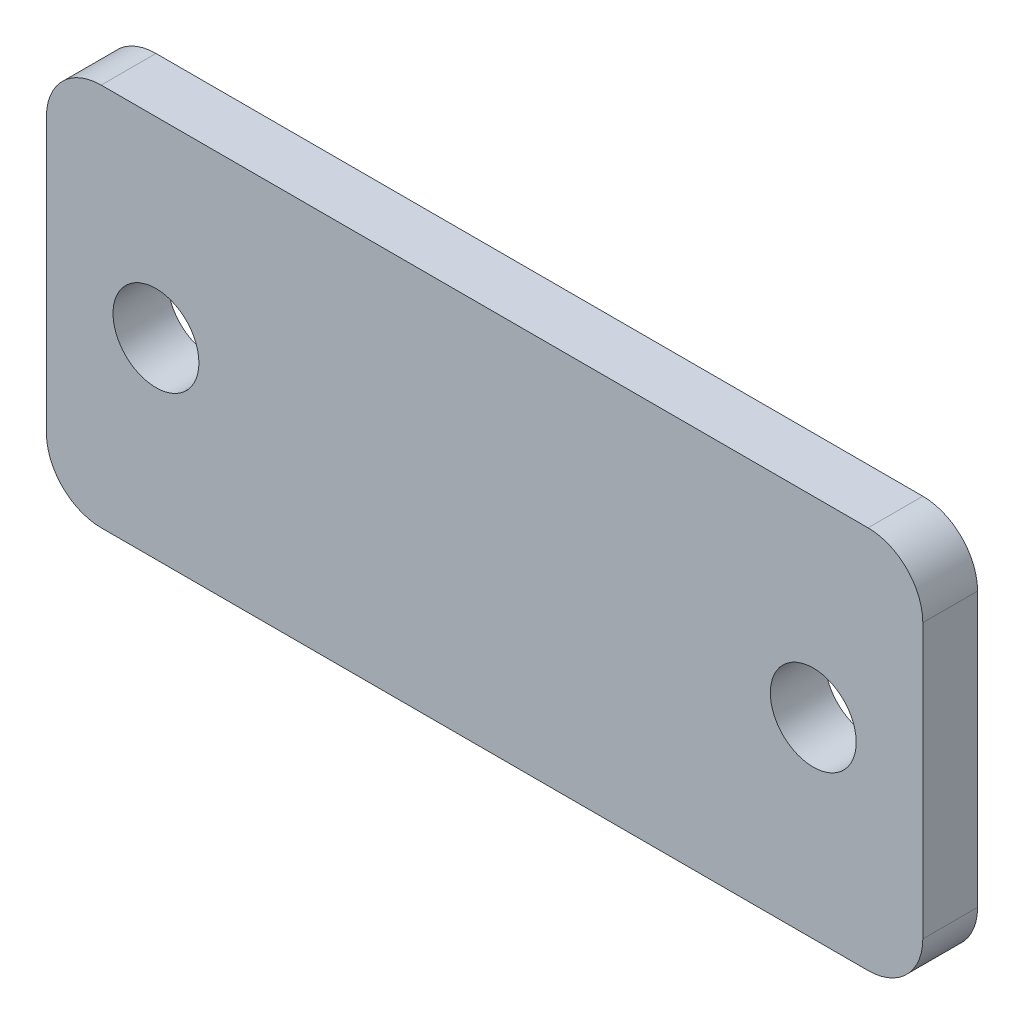
ISO-10303-21;
HEADER;
FILE_DESCRIPTION(('STEP AP214'),'2;1');
FILE_NAME('part.step','',(''),(''),'','','');
FILE_SCHEMA(('AUTOMOTIVE_DESIGN { 1 0 10303 214 1 1 1 1 }'));
ENDSEC;
DATA;
#1=APPLICATION_CONTEXT('core data for automotive mechanical design processes');
#2=APPLICATION_PROTOCOL_DEFINITION('international standard','automotive_design',2000,#1);
#3=PRODUCT_CONTEXT('',#1,'mechanical');
#4=PRODUCT('Part','Part','',(#3));
#5=PRODUCT_RELATED_PRODUCT_CATEGORY('part','',(#4));
#6=PRODUCT_DEFINITION_FORMATION('','',#4);
#7=PRODUCT_DEFINITION_CONTEXT('part definition',#1,'design');
#8=PRODUCT_DEFINITION('design','',#6,#7);
#9=PRODUCT_DEFINITION_SHAPE('','',#8);
#10=(LENGTH_UNIT() NAMED_UNIT(*) SI_UNIT(.MILLI.,.METRE.));
#11=(NAMED_UNIT(*) PLANE_ANGLE_UNIT() SI_UNIT($,.RADIAN.));
#12=(NAMED_UNIT(*) SI_UNIT($,.STERADIAN.) SOLID_ANGLE_UNIT());
#13=UNCERTAINTY_MEASURE_WITH_UNIT(LENGTH_MEASURE(1.E-05),#10,'distance_accuracy_value','');
#14=(GEOMETRIC_REPRESENTATION_CONTEXT(3) GLOBAL_UNCERTAINTY_ASSIGNED_CONTEXT((#13)) GLOBAL_UNIT_ASSIGNED_CONTEXT((#10,
#11,#12)) REPRESENTATION_CONTEXT('',''));
#15=CARTESIAN_POINT('',(0.,0.,0.));
#16=DIRECTION('',(0.,0.,1.));
#17=DIRECTION('',(1.,0.,0.));
#18=AXIS2_PLACEMENT_3D('',#15,#16,#17);
#19=CARTESIAN_POINT('',(0.,0.,3.175));
#20=DIRECTION('',(0.,0.,-1.));
#21=DIRECTION('',(-1.,0.,0.));
#22=AXIS2_PLACEMENT_3D('',#19,#20,#21);
#23=PLANE('',#22);
#24=DIRECTION('',(-1.,0.,0.));
#25=VECTOR('',#24,1.);
#26=CARTESIAN_POINT('',(-25.4,11.1125,3.175));
#27=LINE('',#26,#25);
#28=CARTESIAN_POINT('',(22.225,11.1125,3.175));
#29=VERTEX_POINT('',#28);
#30=CARTESIAN_POINT('',(-22.225,11.1125,3.175));
#31=VERTEX_POINT('',#30);
#32=EDGE_CURVE('E155',#29,#31,#27,.T.);
#33=ORIENTED_EDGE('',*,*,#32,.T.);
#34=CARTESIAN_POINT('',(-22.225,7.9375,3.175));
#35=DIRECTION('',(0.,0.,-1.));
#36=DIRECTION('',(-1.,0.,0.));
#37=AXIS2_PLACEMENT_3D('',#34,#35,#36);
#38=CIRCLE('',#37,3.175);
#39=CARTESIAN_POINT('',(-25.4,7.9375,3.175));
#40=VERTEX_POINT('',#39);
#41=EDGE_CURVE('E184',#31,#40,#38,.F.);
#42=ORIENTED_EDGE('',*,*,#41,.T.);
#43=DIRECTION('',(0.,-1.,0.));
#44=VECTOR('',#43,1.);
#45=CARTESIAN_POINT('',(-25.4,-11.1125,3.175));
#46=LINE('',#45,#44);
#47=CARTESIAN_POINT('',(-25.4,-7.9375,3.175));
#48=VERTEX_POINT('',#47);
#49=EDGE_CURVE('E133',#40,#48,#46,.T.);
#50=ORIENTED_EDGE('',*,*,#49,.T.);
#51=CARTESIAN_POINT('',(-22.225,-7.9375,3.175));
#52=DIRECTION('',(0.,0.,-1.));
#53=DIRECTION('',(-1.,0.,0.));
#54=AXIS2_PLACEMENT_3D('',#51,#52,#53);
#55=CIRCLE('',#54,3.175);
#56=CARTESIAN_POINT('',(-22.225,-11.1125,3.175));
#57=VERTEX_POINT('',#56);
#58=EDGE_CURVE('E179',#48,#57,#55,.F.);
#59=ORIENTED_EDGE('',*,*,#58,.T.);
#60=DIRECTION('',(1.,0.,0.));
#61=VECTOR('',#60,1.);
#62=CARTESIAN_POINT('',(-25.4,-11.1125,3.175));
#63=LINE('',#62,#61);
#64=CARTESIAN_POINT('',(22.225,-11.1125,3.175));
#65=VERTEX_POINT('',#64);
#66=EDGE_CURVE('E199',#57,#65,#63,.T.);
#67=ORIENTED_EDGE('',*,*,#66,.T.);
#68=CARTESIAN_POINT('',(22.225,-7.9375,3.175));
#69=DIRECTION('',(0.,0.,-1.));
#70=DIRECTION('',(-1.,0.,0.));
#71=AXIS2_PLACEMENT_3D('',#68,#69,#70);
#72=CIRCLE('',#71,3.175);
#73=CARTESIAN_POINT('',(25.4,-7.9375,3.175));
#74=VERTEX_POINT('',#73);
#75=EDGE_CURVE('E68',#65,#74,#72,.F.);
#76=ORIENTED_EDGE('',*,*,#75,.T.);
#77=DIRECTION('',(0.,1.,0.));
#78=VECTOR('',#77,1.);
#79=CARTESIAN_POINT('',(25.4,-11.1125,3.175));
#80=LINE('',#79,#78);
#81=CARTESIAN_POINT('',(25.4,7.9375,3.175));
#82=VERTEX_POINT('',#81);
#83=EDGE_CURVE('E207',#74,#82,#80,.T.);
#84=ORIENTED_EDGE('',*,*,#83,.T.);
#85=CARTESIAN_POINT('',(22.225,7.9375,3.175));
#86=DIRECTION('',(0.,0.,-1.));
#87=DIRECTION('',(-1.,0.,0.));
#88=AXIS2_PLACEMENT_3D('',#85,#86,#87);
#89=CIRCLE('',#88,3.175);
#90=EDGE_CURVE('E176',#82,#29,#89,.F.);
#91=ORIENTED_EDGE('',*,*,#90,.T.);
#92=EDGE_LOOP('',(#33,#42,#50,#59,#67,#76,#84,#91));
#93=FACE_BOUND('',#92,.T.);
#94=CARTESIAN_POINT('',(-19.05,0.,3.175));
#95=DIRECTION('',(0.,0.,1.));
#96=DIRECTION('',(1.,0.,0.));
#97=AXIS2_PLACEMENT_3D('',#94,#95,#96);
#98=CIRCLE('',#97,2.4892);
#99=CARTESIAN_POINT('',(-16.5608,0.,3.175));
#100=VERTEX_POINT('',#99);
#101=EDGE_CURVE('E144',#100,#100,#98,.T.);
#102=ORIENTED_EDGE('',*,*,#101,.F.);
#103=EDGE_LOOP('',(#102));
#104=FACE_BOUND('',#103,.T.);
#105=CARTESIAN_POINT('',(19.05,0.,3.175));
#106=DIRECTION('',(0.,0.,1.));
#107=DIRECTION('',(1.,0.,0.));
#108=AXIS2_PLACEMENT_3D('',#105,#106,#107);
#109=CIRCLE('',#108,2.4892);
#110=CARTESIAN_POINT('',(21.5392,0.,3.175));
#111=VERTEX_POINT('',#110);
#112=EDGE_CURVE('E219',#111,#111,#109,.T.);
#113=ORIENTED_EDGE('',*,*,#112,.F.);
#114=EDGE_LOOP('',(#113));
#115=FACE_BOUND('',#114,.T.);
#116=ADVANCED_FACE('F45',(#93,#104,#115),#23,.F.);
#117=CARTESIAN_POINT('',(0.,0.,0.));
#118=DIRECTION('',(0.,0.,-1.));
#119=DIRECTION('',(-1.,0.,0.));
#120=AXIS2_PLACEMENT_3D('',#117,#118,#119);
#121=PLANE('',#120);
#122=CARTESIAN_POINT('',(-19.05,0.,0.));
#123=DIRECTION('',(0.,0.,1.));
#124=DIRECTION('',(1.,0.,0.));
#125=AXIS2_PLACEMENT_3D('',#122,#123,#124);
#126=CIRCLE('',#125,2.4892);
#127=CARTESIAN_POINT('',(-16.5608,0.,0.));
#128=VERTEX_POINT('',#127);
#129=EDGE_CURVE('E152',#128,#128,#126,.T.);
#130=ORIENTED_EDGE('',*,*,#129,.T.);
#131=EDGE_LOOP('',(#130));
#132=FACE_BOUND('',#131,.T.);
#133=DIRECTION('',(0.,-1.,0.));
#134=VECTOR('',#133,1.);
#135=CARTESIAN_POINT('',(-25.4,-11.1125,0.));
#136=LINE('',#135,#134);
#137=CARTESIAN_POINT('',(-25.4,7.9375,0.));
#138=VERTEX_POINT('',#137);
#139=CARTESIAN_POINT('',(-25.4,-7.9375,0.));
#140=VERTEX_POINT('',#139);
#141=EDGE_CURVE('E130',#138,#140,#136,.T.);
#142=ORIENTED_EDGE('',*,*,#141,.F.);
#143=CARTESIAN_POINT('',(-22.225,7.9375,0.));
#144=DIRECTION('',(0.,0.,-1.));
#145=DIRECTION('',(-1.,0.,0.));
#146=AXIS2_PLACEMENT_3D('',#143,#144,#145);
#147=CIRCLE('',#146,3.175);
#148=CARTESIAN_POINT('',(-22.225,11.1125,0.));
#149=VERTEX_POINT('',#148);
#150=EDGE_CURVE('E112',#138,#149,#147,.T.);
#151=ORIENTED_EDGE('',*,*,#150,.T.);
#152=DIRECTION('',(-1.,0.,0.));
#153=VECTOR('',#152,1.);
#154=CARTESIAN_POINT('',(-25.4,11.1125,0.));
#155=LINE('',#154,#153);
#156=CARTESIAN_POINT('',(22.225,11.1125,0.));
#157=VERTEX_POINT('',#156);
#158=EDGE_CURVE('E160',#157,#149,#155,.T.);
#159=ORIENTED_EDGE('',*,*,#158,.F.);
#160=CARTESIAN_POINT('',(22.225,7.9375,0.));
#161=DIRECTION('',(0.,0.,-1.));
#162=DIRECTION('',(-1.,0.,0.));
#163=AXIS2_PLACEMENT_3D('',#160,#161,#162);
#164=CIRCLE('',#163,3.175);
#165=CARTESIAN_POINT('',(25.4,7.9375,0.));
#166=VERTEX_POINT('',#165);
#167=EDGE_CURVE('E135',#157,#166,#164,.T.);
#168=ORIENTED_EDGE('',*,*,#167,.T.);
#169=DIRECTION('',(0.,1.,0.));
#170=VECTOR('',#169,1.);
#171=CARTESIAN_POINT('',(25.4,-11.1125,0.));
#172=LINE('',#171,#170);
#173=CARTESIAN_POINT('',(25.4,-7.9375,0.));
#174=VERTEX_POINT('',#173);
#175=EDGE_CURVE('E149',#174,#166,#172,.T.);
#176=ORIENTED_EDGE('',*,*,#175,.F.);
#177=CARTESIAN_POINT('',(22.225,-7.9375,0.));
#178=DIRECTION('',(0.,0.,-1.));
#179=DIRECTION('',(-1.,0.,0.));
#180=AXIS2_PLACEMENT_3D('',#177,#178,#179);
#181=CIRCLE('',#180,3.175);
#182=CARTESIAN_POINT('',(22.225,-11.1125,0.));
#183=VERTEX_POINT('',#182);
#184=EDGE_CURVE('E124',#174,#183,#181,.T.);
#185=ORIENTED_EDGE('',*,*,#184,.T.);
#186=DIRECTION('',(1.,0.,0.));
#187=VECTOR('',#186,1.);
#188=CARTESIAN_POINT('',(-25.4,-11.1125,0.));
#189=LINE('',#188,#187);
#190=CARTESIAN_POINT('',(-22.225,-11.1125,0.));
#191=VERTEX_POINT('',#190);
#192=EDGE_CURVE('E143',#191,#183,#189,.T.);
#193=ORIENTED_EDGE('',*,*,#192,.F.);
#194=CARTESIAN_POINT('',(-22.225,-7.9375,0.));
#195=DIRECTION('',(0.,0.,-1.));
#196=DIRECTION('',(-1.,0.,0.));
#197=AXIS2_PLACEMENT_3D('',#194,#195,#196);
#198=CIRCLE('',#197,3.175);
#199=EDGE_CURVE('E141',#191,#140,#198,.T.);
#200=ORIENTED_EDGE('',*,*,#199,.T.);
#201=EDGE_LOOP('',(#142,#151,#159,#168,#176,#185,#193,#200));
#202=FACE_BOUND('',#201,.T.);
#203=CARTESIAN_POINT('',(19.05,0.,0.));
#204=DIRECTION('',(0.,0.,1.));
#205=DIRECTION('',(1.,0.,0.));
#206=AXIS2_PLACEMENT_3D('',#203,#204,#205);
#207=CIRCLE('',#206,2.4892);
#208=CARTESIAN_POINT('',(21.5392,0.,0.));
#209=VERTEX_POINT('',#208);
#210=EDGE_CURVE('E221',#209,#209,#207,.T.);
#211=ORIENTED_EDGE('',*,*,#210,.T.);
#212=EDGE_LOOP('',(#211));
#213=FACE_BOUND('',#212,.T.);
#214=ADVANCED_FACE('F138',(#132,#202,#213),#121,.T.);
#215=CARTESIAN_POINT('',(-25.4,-11.1125,3.175));
#216=DIRECTION('',(1.,0.,0.));
#217=DIRECTION('',(0.,0.,-1.));
#218=AXIS2_PLACEMENT_3D('',#215,#216,#217);
#219=PLANE('',#218);
#220=ORIENTED_EDGE('',*,*,#49,.F.);
#221=DIRECTION('',(0.,0.,-1.));
#222=VECTOR('',#221,1.);
#223=CARTESIAN_POINT('',(-25.4,7.9375,3.175));
#224=LINE('',#223,#222);
#225=EDGE_CURVE('E116',#40,#138,#224,.T.);
#226=ORIENTED_EDGE('',*,*,#225,.T.);
#227=ORIENTED_EDGE('',*,*,#141,.T.);
#228=DIRECTION('',(0.,0.,-1.));
#229=VECTOR('',#228,1.);
#230=CARTESIAN_POINT('',(-25.4,-7.9375,3.175));
#231=LINE('',#230,#229);
#232=EDGE_CURVE('E136',#140,#48,#231,.F.);
#233=ORIENTED_EDGE('',*,*,#232,.T.);
#234=EDGE_LOOP('',(#220,#226,#227,#233));
#235=FACE_BOUND('',#234,.T.);
#236=ADVANCED_FACE('F129',(#235),#219,.F.);
#237=CARTESIAN_POINT('',(-25.4,-11.1125,3.175));
#238=DIRECTION('',(0.,1.,0.));
#239=DIRECTION('',(0.,0.,1.));
#240=AXIS2_PLACEMENT_3D('',#237,#238,#239);
#241=PLANE('',#240);
#242=ORIENTED_EDGE('',*,*,#192,.T.);
#243=DIRECTION('',(0.,0.,-1.));
#244=VECTOR('',#243,1.);
#245=CARTESIAN_POINT('',(22.225,-11.1125,3.175));
#246=LINE('',#245,#244);
#247=EDGE_CURVE('E11',#183,#65,#246,.F.);
#248=ORIENTED_EDGE('',*,*,#247,.T.);
#249=ORIENTED_EDGE('',*,*,#66,.F.);
#250=DIRECTION('',(0.,0.,-1.));
#251=VECTOR('',#250,1.);
#252=CARTESIAN_POINT('',(-22.225,-11.1125,3.175));
#253=LINE('',#252,#251);
#254=EDGE_CURVE('E54',#57,#191,#253,.T.);
#255=ORIENTED_EDGE('',*,*,#254,.T.);
#256=EDGE_LOOP('',(#242,#248,#249,#255));
#257=FACE_BOUND('',#256,.T.);
#258=ADVANCED_FACE('F197',(#257),#241,.F.);
#259=CARTESIAN_POINT('',(25.4,-11.1125,3.175));
#260=DIRECTION('',(-1.,0.,0.));
#261=DIRECTION('',(0.,0.,1.));
#262=AXIS2_PLACEMENT_3D('',#259,#260,#261);
#263=PLANE('',#262);
#264=ORIENTED_EDGE('',*,*,#83,.F.);
#265=DIRECTION('',(0.,0.,-1.));
#266=VECTOR('',#265,1.);
#267=CARTESIAN_POINT('',(25.4,-7.9375,3.175));
#268=LINE('',#267,#266);
#269=EDGE_CURVE('E189',#74,#174,#268,.T.);
#270=ORIENTED_EDGE('',*,*,#269,.T.);
#271=ORIENTED_EDGE('',*,*,#175,.T.);
#272=DIRECTION('',(0.,0.,-1.));
#273=VECTOR('',#272,1.);
#274=CARTESIAN_POINT('',(25.4,7.9375,3.175));
#275=LINE('',#274,#273);
#276=EDGE_CURVE('E61',#166,#82,#275,.F.);
#277=ORIENTED_EDGE('',*,*,#276,.T.);
#278=EDGE_LOOP('',(#264,#270,#271,#277));
#279=FACE_BOUND('',#278,.T.);
#280=ADVANCED_FACE('F206',(#279),#263,.F.);
#281=CARTESIAN_POINT('',(-25.4,11.1125,3.175));
#282=DIRECTION('',(0.,-1.,0.));
#283=DIRECTION('',(1.,0.,0.));
#284=AXIS2_PLACEMENT_3D('',#281,#282,#283);
#285=PLANE('',#284);
#286=ORIENTED_EDGE('',*,*,#158,.T.);
#287=DIRECTION('',(0.,0.,-1.));
#288=VECTOR('',#287,1.);
#289=CARTESIAN_POINT('',(-22.225,11.1125,3.175));
#290=LINE('',#289,#288);
#291=EDGE_CURVE('E117',#149,#31,#290,.F.);
#292=ORIENTED_EDGE('',*,*,#291,.T.);
#293=ORIENTED_EDGE('',*,*,#32,.F.);
#294=DIRECTION('',(0.,0.,-1.));
#295=VECTOR('',#294,1.);
#296=CARTESIAN_POINT('',(22.225,11.1125,3.175));
#297=LINE('',#296,#295);
#298=EDGE_CURVE('E123',#29,#157,#297,.T.);
#299=ORIENTED_EDGE('',*,*,#298,.T.);
#300=EDGE_LOOP('',(#286,#292,#293,#299));
#301=FACE_BOUND('',#300,.T.);
#302=ADVANCED_FACE('F245',(#301),#285,.F.);
#303=CARTESIAN_POINT('',(-19.05,0.,3.175));
#304=DIRECTION('',(0.,0.,-1.));
#305=DIRECTION('',(-1.,0.,0.));
#306=AXIS2_PLACEMENT_3D('',#303,#304,#305);
#307=CYLINDRICAL_SURFACE('',#306,2.4892);
#308=ORIENTED_EDGE('',*,*,#101,.T.);
#309=EDGE_LOOP('',(#308));
#310=FACE_BOUND('',#309,.T.);
#311=ORIENTED_EDGE('',*,*,#129,.F.);
#312=EDGE_LOOP('',(#311));
#313=FACE_BOUND('',#312,.T.);
#314=ADVANCED_FACE('F242',(#310,#313),#307,.F.);
#315=CARTESIAN_POINT('',(19.05,0.,3.175));
#316=DIRECTION('',(0.,0.,-1.));
#317=DIRECTION('',(-1.,0.,0.));
#318=AXIS2_PLACEMENT_3D('',#315,#316,#317);
#319=CYLINDRICAL_SURFACE('',#318,2.4892);
#320=ORIENTED_EDGE('',*,*,#112,.T.);
#321=EDGE_LOOP('',(#320));
#322=FACE_BOUND('',#321,.T.);
#323=ORIENTED_EDGE('',*,*,#210,.F.);
#324=EDGE_LOOP('',(#323));
#325=FACE_BOUND('',#324,.T.);
#326=ADVANCED_FACE('F229',(#322,#325),#319,.F.);
#327=CARTESIAN_POINT('',(-22.225,7.9375,3.175));
#328=DIRECTION('',(0.,0.,-1.));
#329=DIRECTION('',(-1.,0.,0.));
#330=AXIS2_PLACEMENT_3D('',#327,#328,#329);
#331=CYLINDRICAL_SURFACE('',#330,3.175);
#332=ORIENTED_EDGE('',*,*,#41,.F.);
#333=ORIENTED_EDGE('',*,*,#291,.F.);
#334=ORIENTED_EDGE('',*,*,#150,.F.);
#335=ORIENTED_EDGE('',*,*,#225,.F.);
#336=EDGE_LOOP('',(#332,#333,#334,#335));
#337=FACE_BOUND('',#336,.T.);
#338=ADVANCED_FACE('F115',(#337),#331,.T.);
#339=CARTESIAN_POINT('',(22.225,-7.9375,3.175));
#340=DIRECTION('',(0.,0.,-1.));
#341=DIRECTION('',(-1.,0.,0.));
#342=AXIS2_PLACEMENT_3D('',#339,#340,#341);
#343=CYLINDRICAL_SURFACE('',#342,3.175);
#344=ORIENTED_EDGE('',*,*,#75,.F.);
#345=ORIENTED_EDGE('',*,*,#247,.F.);
#346=ORIENTED_EDGE('',*,*,#184,.F.);
#347=ORIENTED_EDGE('',*,*,#269,.F.);
#348=EDGE_LOOP('',(#344,#345,#346,#347));
#349=FACE_BOUND('',#348,.T.);
#350=ADVANCED_FACE('F205',(#349),#343,.T.);
#351=CARTESIAN_POINT('',(-22.225,-7.9375,3.175));
#352=DIRECTION('',(0.,0.,-1.));
#353=DIRECTION('',(-1.,0.,0.));
#354=AXIS2_PLACEMENT_3D('',#351,#352,#353);
#355=CYLINDRICAL_SURFACE('',#354,3.175);
#356=ORIENTED_EDGE('',*,*,#58,.F.);
#357=ORIENTED_EDGE('',*,*,#232,.F.);
#358=ORIENTED_EDGE('',*,*,#199,.F.);
#359=ORIENTED_EDGE('',*,*,#254,.F.);
#360=EDGE_LOOP('',(#356,#357,#358,#359));
#361=FACE_BOUND('',#360,.T.);
#362=ADVANCED_FACE('F258',(#361),#355,.T.);
#363=CARTESIAN_POINT('',(22.225,7.9375,3.175));
#364=DIRECTION('',(0.,0.,-1.));
#365=DIRECTION('',(-1.,0.,0.));
#366=AXIS2_PLACEMENT_3D('',#363,#364,#365);
#367=CYLINDRICAL_SURFACE('',#366,3.175);
#368=ORIENTED_EDGE('',*,*,#90,.F.);
#369=ORIENTED_EDGE('',*,*,#276,.F.);
#370=ORIENTED_EDGE('',*,*,#167,.F.);
#371=ORIENTED_EDGE('',*,*,#298,.F.);
#372=EDGE_LOOP('',(#368,#369,#370,#371));
#373=FACE_BOUND('',#372,.T.);
#374=ADVANCED_FACE('F47',(#373),#367,.T.);
#375=CLOSED_SHELL('',(#116,#214,#236,#258,#280,#302,#314,#326,#338,#350,#362,#374));
#376=MANIFOLD_SOLID_BREP('B2',#375);
#377=ADVANCED_BREP_SHAPE_REPRESENTATION('',(#18,#376),#14);
#378=SHAPE_DEFINITION_REPRESENTATION(#9,#377);
ENDSEC;
END-ISO-10303-21;
